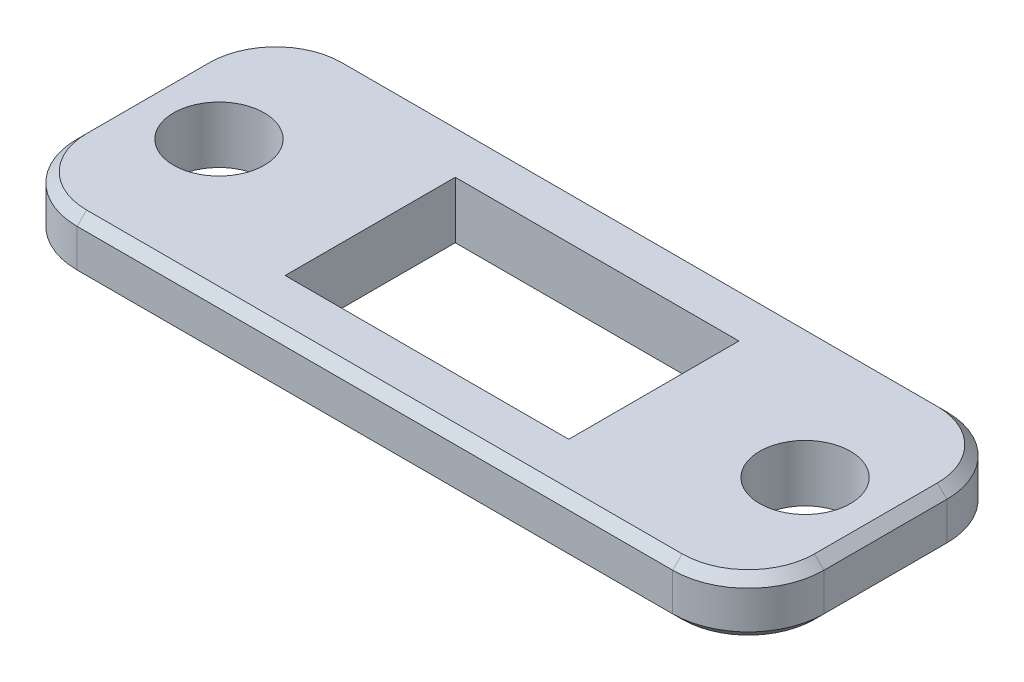
ISO-10303-21;
HEADER;
FILE_DESCRIPTION(('STEP AP214'),'2;1');
FILE_NAME('part.step','',(''),(''),'','','');
FILE_SCHEMA(('AUTOMOTIVE_DESIGN { 1 0 10303 214 1 1 1 1 }'));
ENDSEC;
DATA;
#1=APPLICATION_CONTEXT('core data for automotive mechanical design processes');
#2=APPLICATION_PROTOCOL_DEFINITION('international standard','automotive_design',2000,#1);
#3=PRODUCT_CONTEXT('',#1,'mechanical');
#4=PRODUCT('Part','Part','',(#3));
#5=PRODUCT_RELATED_PRODUCT_CATEGORY('part','',(#4));
#6=PRODUCT_DEFINITION_FORMATION('','',#4);
#7=PRODUCT_DEFINITION_CONTEXT('part definition',#1,'design');
#8=PRODUCT_DEFINITION('design','',#6,#7);
#9=PRODUCT_DEFINITION_SHAPE('','',#8);
#10=(LENGTH_UNIT() NAMED_UNIT(*) SI_UNIT(.MILLI.,.METRE.));
#11=(NAMED_UNIT(*) PLANE_ANGLE_UNIT() SI_UNIT($,.RADIAN.));
#12=(NAMED_UNIT(*) SI_UNIT($,.STERADIAN.) SOLID_ANGLE_UNIT());
#13=UNCERTAINTY_MEASURE_WITH_UNIT(LENGTH_MEASURE(1.E-05),#10,'distance_accuracy_value','');
#14=(GEOMETRIC_REPRESENTATION_CONTEXT(3) GLOBAL_UNCERTAINTY_ASSIGNED_CONTEXT((#13)) GLOBAL_UNIT_ASSIGNED_CONTEXT((#10,
#11,#12)) REPRESENTATION_CONTEXT('',''));
#15=CARTESIAN_POINT('',(0.,0.,0.));
#16=DIRECTION('',(0.,0.,1.));
#17=DIRECTION('',(1.,0.,0.));
#18=AXIS2_PLACEMENT_3D('',#15,#16,#17);
#19=CARTESIAN_POINT('',(0.,0.,0.));
#20=DIRECTION('',(0.,-1.,0.));
#21=DIRECTION('',(0.,0.,-1.));
#22=AXIS2_PLACEMENT_3D('',#19,#20,#21);
#23=PLANE('',#22);
#24=CARTESIAN_POINT('',(-15.75,0.,-3.25));
#25=DIRECTION('',(0.,-1.,0.));
#26=DIRECTION('',(0.,0.,-1.));
#27=AXIS2_PLACEMENT_3D('',#24,#25,#26);
#28=CIRCLE('',#27,3.5);
#29=CARTESIAN_POINT('',(-19.25,0.,-3.25));
#30=VERTEX_POINT('',#29);
#31=CARTESIAN_POINT('',(-15.75,0.,-6.74999999999999));
#32=VERTEX_POINT('',#31);
#33=EDGE_CURVE('E263',#30,#32,#28,.T.);
#34=ORIENTED_EDGE('',*,*,#33,.T.);
#35=DIRECTION('',(1.,0.,0.));
#36=VECTOR('',#35,1.);
#37=CARTESIAN_POINT('',(15.75,0.,-6.74999999999999));
#38=LINE('',#37,#36);
#39=CARTESIAN_POINT('',(15.75,0.,-6.74999999999999));
#40=VERTEX_POINT('',#39);
#41=EDGE_CURVE('E265',#32,#40,#38,.T.);
#42=ORIENTED_EDGE('',*,*,#41,.T.);
#43=CARTESIAN_POINT('',(15.75,0.,-3.25));
#44=DIRECTION('',(0.,-1.,0.));
#45=DIRECTION('',(0.,0.,-1.));
#46=AXIS2_PLACEMENT_3D('',#43,#44,#45);
#47=CIRCLE('',#46,3.5);
#48=CARTESIAN_POINT('',(19.25,0.,-3.25));
#49=VERTEX_POINT('',#48);
#50=EDGE_CURVE('E261',#40,#49,#47,.T.);
#51=ORIENTED_EDGE('',*,*,#50,.T.);
#52=DIRECTION('',(0.,0.,1.));
#53=VECTOR('',#52,1.);
#54=CARTESIAN_POINT('',(19.25,0.,3.25));
#55=LINE('',#54,#53);
#56=CARTESIAN_POINT('',(19.25,0.,3.25));
#57=VERTEX_POINT('',#56);
#58=EDGE_CURVE('E257',#49,#57,#55,.T.);
#59=ORIENTED_EDGE('',*,*,#58,.T.);
#60=CARTESIAN_POINT('',(15.75,0.,3.25));
#61=DIRECTION('',(0.,-1.,0.));
#62=DIRECTION('',(0.,0.,-1.));
#63=AXIS2_PLACEMENT_3D('',#60,#61,#62);
#64=CIRCLE('',#63,3.5);
#65=CARTESIAN_POINT('',(15.75,0.,6.75));
#66=VERTEX_POINT('',#65);
#67=EDGE_CURVE('E253',#57,#66,#64,.T.);
#68=ORIENTED_EDGE('',*,*,#67,.T.);
#69=DIRECTION('',(-1.,0.,0.));
#70=VECTOR('',#69,1.);
#71=CARTESIAN_POINT('',(-15.75,0.,6.75));
#72=LINE('',#71,#70);
#73=CARTESIAN_POINT('',(-15.75,0.,6.75));
#74=VERTEX_POINT('',#73);
#75=EDGE_CURVE('E251',#66,#74,#72,.T.);
#76=ORIENTED_EDGE('',*,*,#75,.T.);
#77=CARTESIAN_POINT('',(-15.75,0.,3.25));
#78=DIRECTION('',(0.,-1.,0.));
#79=DIRECTION('',(0.,0.,-1.));
#80=AXIS2_PLACEMENT_3D('',#77,#78,#79);
#81=CIRCLE('',#80,3.5);
#82=CARTESIAN_POINT('',(-19.25,0.,3.25));
#83=VERTEX_POINT('',#82);
#84=EDGE_CURVE('E255',#74,#83,#81,.T.);
#85=ORIENTED_EDGE('',*,*,#84,.T.);
#86=DIRECTION('',(0.,0.,-1.));
#87=VECTOR('',#86,1.);
#88=CARTESIAN_POINT('',(-19.25,0.,-3.24999999999999));
#89=LINE('',#88,#87);
#90=EDGE_CURVE('E259',#83,#30,#89,.T.);
#91=ORIENTED_EDGE('',*,*,#90,.T.);
#92=EDGE_LOOP('',(#34,#42,#51,#59,#68,#76,#85,#91));
#93=FACE_BOUND('',#92,.T.);
#94=CARTESIAN_POINT('',(-15.5,0.,0.));
#95=DIRECTION('',(0.,1.,0.));
#96=DIRECTION('',(0.,0.,1.));
#97=AXIS2_PLACEMENT_3D('',#94,#95,#96);
#98=CIRCLE('',#97,2.4);
#99=CARTESIAN_POINT('',(-15.5,0.,2.4));
#100=VERTEX_POINT('',#99);
#101=EDGE_CURVE('E434',#100,#100,#98,.T.);
#102=ORIENTED_EDGE('',*,*,#101,.T.);
#103=EDGE_LOOP('',(#102));
#104=FACE_BOUND('',#103,.T.);
#105=DIRECTION('',(1.,0.,0.));
#106=VECTOR('',#105,1.);
#107=CARTESIAN_POINT('',(-7.5,0.,4.5));
#108=LINE('',#107,#106);
#109=CARTESIAN_POINT('',(-7.5,0.,4.5));
#110=VERTEX_POINT('',#109);
#111=CARTESIAN_POINT('',(7.5,0.,4.5));
#112=VERTEX_POINT('',#111);
#113=EDGE_CURVE('E189',#110,#112,#108,.T.);
#114=ORIENTED_EDGE('',*,*,#113,.T.);
#115=DIRECTION('',(0.,0.,-1.));
#116=VECTOR('',#115,1.);
#117=CARTESIAN_POINT('',(7.5,0.,4.5));
#118=LINE('',#117,#116);
#119=CARTESIAN_POINT('',(7.5,0.,-4.5));
#120=VERTEX_POINT('',#119);
#121=EDGE_CURVE('E209',#112,#120,#118,.T.);
#122=ORIENTED_EDGE('',*,*,#121,.T.);
#123=DIRECTION('',(-1.,0.,0.));
#124=VECTOR('',#123,1.);
#125=CARTESIAN_POINT('',(-7.5,0.,-4.5));
#126=LINE('',#125,#124);
#127=CARTESIAN_POINT('',(-7.5,0.,-4.5));
#128=VERTEX_POINT('',#127);
#129=EDGE_CURVE('E195',#120,#128,#126,.T.);
#130=ORIENTED_EDGE('',*,*,#129,.T.);
#131=DIRECTION('',(0.,0.,1.));
#132=VECTOR('',#131,1.);
#133=CARTESIAN_POINT('',(-7.5,0.,4.5));
#134=LINE('',#133,#132);
#135=EDGE_CURVE('E213',#128,#110,#134,.T.);
#136=ORIENTED_EDGE('',*,*,#135,.T.);
#137=EDGE_LOOP('',(#114,#122,#130,#136));
#138=FACE_BOUND('',#137,.T.);
#139=CARTESIAN_POINT('',(15.5,0.,0.));
#140=DIRECTION('',(0.,1.,0.));
#141=DIRECTION('',(0.,0.,1.));
#142=AXIS2_PLACEMENT_3D('',#139,#140,#141);
#143=CIRCLE('',#142,2.4);
#144=CARTESIAN_POINT('',(15.5,0.,2.39999999999999));
#145=VERTEX_POINT('',#144);
#146=EDGE_CURVE('E211',#145,#145,#143,.T.);
#147=ORIENTED_EDGE('',*,*,#146,.T.);
#148=EDGE_LOOP('',(#147));
#149=FACE_BOUND('',#148,.T.);
#150=ADVANCED_FACE('F35',(#93,#104,#138,#149),#23,.T.);
#151=CARTESIAN_POINT('',(0.,3.,0.));
#152=DIRECTION('',(0.,-1.,0.));
#153=DIRECTION('',(0.,0.,-1.));
#154=AXIS2_PLACEMENT_3D('',#151,#152,#153);
#155=PLANE('',#154);
#156=CARTESIAN_POINT('',(15.75,3.,-3.25));
#157=DIRECTION('',(0.,-1.,0.));
#158=DIRECTION('',(0.,0.,-1.));
#159=AXIS2_PLACEMENT_3D('',#156,#157,#158);
#160=CIRCLE('',#159,3.5);
#161=CARTESIAN_POINT('',(19.25,3.,-3.25));
#162=VERTEX_POINT('',#161);
#163=CARTESIAN_POINT('',(15.75,3.,-6.74999999999999));
#164=VERTEX_POINT('',#163);
#165=EDGE_CURVE('E60',#162,#164,#160,.F.);
#166=ORIENTED_EDGE('',*,*,#165,.T.);
#167=DIRECTION('',(-1.,0.,0.));
#168=VECTOR('',#167,1.);
#169=CARTESIAN_POINT('',(0.,3.,-6.74999999999999));
#170=LINE('',#169,#168);
#171=CARTESIAN_POINT('',(-15.75,3.,-6.74999999999999));
#172=VERTEX_POINT('',#171);
#173=EDGE_CURVE('E11',#164,#172,#170,.T.);
#174=ORIENTED_EDGE('',*,*,#173,.T.);
#175=CARTESIAN_POINT('',(-15.75,3.,-3.25));
#176=DIRECTION('',(0.,-1.,0.));
#177=DIRECTION('',(0.,0.,-1.));
#178=AXIS2_PLACEMENT_3D('',#175,#176,#177);
#179=CIRCLE('',#178,3.5);
#180=CARTESIAN_POINT('',(-19.25,3.,-3.25));
#181=VERTEX_POINT('',#180);
#182=EDGE_CURVE('E45',#172,#181,#179,.F.);
#183=ORIENTED_EDGE('',*,*,#182,.T.);
#184=DIRECTION('',(0.,0.,1.));
#185=VECTOR('',#184,1.);
#186=CARTESIAN_POINT('',(-19.25,3.,0.));
#187=LINE('',#186,#185);
#188=CARTESIAN_POINT('',(-19.25,3.,3.25));
#189=VERTEX_POINT('',#188);
#190=EDGE_CURVE('E304',#181,#189,#187,.T.);
#191=ORIENTED_EDGE('',*,*,#190,.T.);
#192=CARTESIAN_POINT('',(-15.75,3.,3.25));
#193=DIRECTION('',(0.,-1.,0.));
#194=DIRECTION('',(0.,0.,-1.));
#195=AXIS2_PLACEMENT_3D('',#192,#193,#194);
#196=CIRCLE('',#195,3.5);
#197=CARTESIAN_POINT('',(-15.75,3.,6.75));
#198=VERTEX_POINT('',#197);
#199=EDGE_CURVE('E300',#189,#198,#196,.F.);
#200=ORIENTED_EDGE('',*,*,#199,.T.);
#201=DIRECTION('',(1.,0.,0.));
#202=VECTOR('',#201,1.);
#203=CARTESIAN_POINT('',(0.,3.,6.75));
#204=LINE('',#203,#202);
#205=CARTESIAN_POINT('',(15.75,3.,6.75));
#206=VERTEX_POINT('',#205);
#207=EDGE_CURVE('E296',#198,#206,#204,.T.);
#208=ORIENTED_EDGE('',*,*,#207,.T.);
#209=CARTESIAN_POINT('',(15.75,3.,3.25));
#210=DIRECTION('',(0.,-1.,0.));
#211=DIRECTION('',(0.,0.,-1.));
#212=AXIS2_PLACEMENT_3D('',#209,#210,#211);
#213=CIRCLE('',#212,3.5);
#214=CARTESIAN_POINT('',(19.25,3.,3.25));
#215=VERTEX_POINT('',#214);
#216=EDGE_CURVE('E298',#206,#215,#213,.F.);
#217=ORIENTED_EDGE('',*,*,#216,.T.);
#218=DIRECTION('',(0.,0.,-1.));
#219=VECTOR('',#218,1.);
#220=CARTESIAN_POINT('',(19.25,3.,0.));
#221=LINE('',#220,#219);
#222=EDGE_CURVE('E302',#215,#162,#221,.T.);
#223=ORIENTED_EDGE('',*,*,#222,.T.);
#224=EDGE_LOOP('',(#166,#174,#183,#191,#200,#208,#217,#223));
#225=FACE_BOUND('',#224,.T.);
#226=CARTESIAN_POINT('',(-15.5,3.,0.));
#227=DIRECTION('',(0.,1.,0.));
#228=DIRECTION('',(0.,0.,1.));
#229=AXIS2_PLACEMENT_3D('',#226,#227,#228);
#230=CIRCLE('',#229,2.4);
#231=CARTESIAN_POINT('',(-15.5,3.,2.4));
#232=VERTEX_POINT('',#231);
#233=EDGE_CURVE('E330',#232,#232,#230,.T.);
#234=ORIENTED_EDGE('',*,*,#233,.F.);
#235=EDGE_LOOP('',(#234));
#236=FACE_BOUND('',#235,.T.);
#237=CARTESIAN_POINT('',(15.5,3.,0.));
#238=DIRECTION('',(0.,1.,0.));
#239=DIRECTION('',(0.,0.,1.));
#240=AXIS2_PLACEMENT_3D('',#237,#238,#239);
#241=CIRCLE('',#240,2.4);
#242=CARTESIAN_POINT('',(15.5,3.,2.39999999999999));
#243=VERTEX_POINT('',#242);
#244=EDGE_CURVE('E432',#243,#243,#241,.T.);
#245=ORIENTED_EDGE('',*,*,#244,.F.);
#246=EDGE_LOOP('',(#245));
#247=FACE_BOUND('',#246,.T.);
#248=DIRECTION('',(0.,0.,-1.));
#249=VECTOR('',#248,1.);
#250=CARTESIAN_POINT('',(7.5,3.,4.5));
#251=LINE('',#250,#249);
#252=CARTESIAN_POINT('',(7.5,3.,4.5));
#253=VERTEX_POINT('',#252);
#254=CARTESIAN_POINT('',(7.5,3.,-4.5));
#255=VERTEX_POINT('',#254);
#256=EDGE_CURVE('E178',#253,#255,#251,.T.);
#257=ORIENTED_EDGE('',*,*,#256,.F.);
#258=DIRECTION('',(1.,0.,0.));
#259=VECTOR('',#258,1.);
#260=CARTESIAN_POINT('',(-7.5,3.,4.5));
#261=LINE('',#260,#259);
#262=CARTESIAN_POINT('',(-7.5,3.,4.5));
#263=VERTEX_POINT('',#262);
#264=EDGE_CURVE('E204',#263,#253,#261,.T.);
#265=ORIENTED_EDGE('',*,*,#264,.F.);
#266=DIRECTION('',(0.,0.,1.));
#267=VECTOR('',#266,1.);
#268=CARTESIAN_POINT('',(-7.5,3.,4.5));
#269=LINE('',#268,#267);
#270=CARTESIAN_POINT('',(-7.5,3.,-4.5));
#271=VERTEX_POINT('',#270);
#272=EDGE_CURVE('E202',#271,#263,#269,.T.);
#273=ORIENTED_EDGE('',*,*,#272,.F.);
#274=DIRECTION('',(-1.,0.,0.));
#275=VECTOR('',#274,1.);
#276=CARTESIAN_POINT('',(-7.5,3.,-4.5));
#277=LINE('',#276,#275);
#278=EDGE_CURVE('E188',#255,#271,#277,.T.);
#279=ORIENTED_EDGE('',*,*,#278,.F.);
#280=EDGE_LOOP('',(#257,#265,#273,#279));
#281=FACE_BOUND('',#280,.T.);
#282=ADVANCED_FACE('F200',(#225,#236,#247,#281),#155,.F.);
#283=CARTESIAN_POINT('',(19.75,3.,7.25));
#284=DIRECTION('',(-1.,0.,0.));
#285=DIRECTION('',(0.,0.,1.));
#286=AXIS2_PLACEMENT_3D('',#283,#284,#285);
#287=PLANE('',#286);
#288=DIRECTION('',(0.,-1.,0.));
#289=VECTOR('',#288,1.);
#290=CARTESIAN_POINT('',(19.75,3.,3.25));
#291=LINE('',#290,#289);
#292=CARTESIAN_POINT('',(19.75,2.5,3.25));
#293=VERTEX_POINT('',#292);
#294=CARTESIAN_POINT('',(19.75,0.500000000000004,3.25));
#295=VERTEX_POINT('',#294);
#296=EDGE_CURVE('E224',#293,#295,#291,.T.);
#297=ORIENTED_EDGE('',*,*,#296,.T.);
#298=DIRECTION('',(0.,0.,-1.));
#299=VECTOR('',#298,1.);
#300=CARTESIAN_POINT('',(19.75,0.500000000000004,-3.24999999999999));
#301=LINE('',#300,#299);
#302=CARTESIAN_POINT('',(19.75,0.500000000000004,-3.25));
#303=VERTEX_POINT('',#302);
#304=EDGE_CURVE('E282',#295,#303,#301,.T.);
#305=ORIENTED_EDGE('',*,*,#304,.T.);
#306=DIRECTION('',(0.,-1.,0.));
#307=VECTOR('',#306,1.);
#308=CARTESIAN_POINT('',(19.75,3.,-3.25));
#309=LINE('',#308,#307);
#310=CARTESIAN_POINT('',(19.75,2.5,-3.25));
#311=VERTEX_POINT('',#310);
#312=EDGE_CURVE('E196',#303,#311,#309,.F.);
#313=ORIENTED_EDGE('',*,*,#312,.T.);
#314=DIRECTION('',(0.,0.,1.));
#315=VECTOR('',#314,1.);
#316=CARTESIAN_POINT('',(19.75,2.5,7.25));
#317=LINE('',#316,#315);
#318=EDGE_CURVE('E280',#311,#293,#317,.T.);
#319=ORIENTED_EDGE('',*,*,#318,.T.);
#320=EDGE_LOOP('',(#297,#305,#313,#319));
#321=FACE_BOUND('',#320,.T.);
#322=ADVANCED_FACE('F395',(#321),#287,.F.);
#323=CARTESIAN_POINT('',(-19.75,3.,-7.25));
#324=DIRECTION('',(0.,0.,1.));
#325=DIRECTION('',(1.,0.,0.));
#326=AXIS2_PLACEMENT_3D('',#323,#324,#325);
#327=PLANE('',#326);
#328=DIRECTION('',(0.,-1.,0.));
#329=VECTOR('',#328,1.);
#330=CARTESIAN_POINT('',(15.75,3.,-7.25));
#331=LINE('',#330,#329);
#332=CARTESIAN_POINT('',(15.75,2.5,-7.25));
#333=VERTEX_POINT('',#332);
#334=CARTESIAN_POINT('',(15.75,0.500000000000004,-7.25));
#335=VERTEX_POINT('',#334);
#336=EDGE_CURVE('E236',#333,#335,#331,.T.);
#337=ORIENTED_EDGE('',*,*,#336,.T.);
#338=DIRECTION('',(-1.,0.,0.));
#339=VECTOR('',#338,1.);
#340=CARTESIAN_POINT('',(-15.75,0.500000000000004,-7.25));
#341=LINE('',#340,#339);
#342=CARTESIAN_POINT('',(-15.75,0.500000000000004,-7.25));
#343=VERTEX_POINT('',#342);
#344=EDGE_CURVE('E248',#335,#343,#341,.T.);
#345=ORIENTED_EDGE('',*,*,#344,.T.);
#346=DIRECTION('',(0.,-1.,0.));
#347=VECTOR('',#346,1.);
#348=CARTESIAN_POINT('',(-15.75,3.,-7.25));
#349=LINE('',#348,#347);
#350=CARTESIAN_POINT('',(-15.75,2.5,-7.25));
#351=VERTEX_POINT('',#350);
#352=EDGE_CURVE('E233',#343,#351,#349,.F.);
#353=ORIENTED_EDGE('',*,*,#352,.T.);
#354=DIRECTION('',(1.,0.,0.));
#355=VECTOR('',#354,1.);
#356=CARTESIAN_POINT('',(-19.75,2.5,-7.25));
#357=LINE('',#356,#355);
#358=EDGE_CURVE('E245',#351,#333,#357,.T.);
#359=ORIENTED_EDGE('',*,*,#358,.T.);
#360=EDGE_LOOP('',(#337,#345,#353,#359));
#361=FACE_BOUND('',#360,.T.);
#362=ADVANCED_FACE('F415',(#361),#327,.F.);
#363=CARTESIAN_POINT('',(-19.75,3.,7.25));
#364=DIRECTION('',(1.,0.,0.));
#365=DIRECTION('',(0.,0.,-1.));
#366=AXIS2_PLACEMENT_3D('',#363,#364,#365);
#367=PLANE('',#366);
#368=DIRECTION('',(0.,-1.,0.));
#369=VECTOR('',#368,1.);
#370=CARTESIAN_POINT('',(-19.75,3.,-3.25));
#371=LINE('',#370,#369);
#372=CARTESIAN_POINT('',(-19.75,2.5,-3.25));
#373=VERTEX_POINT('',#372);
#374=CARTESIAN_POINT('',(-19.75,0.500000000000004,-3.25));
#375=VERTEX_POINT('',#374);
#376=EDGE_CURVE('E239',#373,#375,#371,.T.);
#377=ORIENTED_EDGE('',*,*,#376,.T.);
#378=DIRECTION('',(0.,0.,1.));
#379=VECTOR('',#378,1.);
#380=CARTESIAN_POINT('',(-19.75,0.500000000000004,3.25));
#381=LINE('',#380,#379);
#382=CARTESIAN_POINT('',(-19.75,0.500000000000004,3.25));
#383=VERTEX_POINT('',#382);
#384=EDGE_CURVE('E278',#375,#383,#381,.T.);
#385=ORIENTED_EDGE('',*,*,#384,.T.);
#386=DIRECTION('',(0.,-1.,0.));
#387=VECTOR('',#386,1.);
#388=CARTESIAN_POINT('',(-19.75,3.,3.25));
#389=LINE('',#388,#387);
#390=CARTESIAN_POINT('',(-19.75,2.5,3.25));
#391=VERTEX_POINT('',#390);
#392=EDGE_CURVE('E242',#383,#391,#389,.F.);
#393=ORIENTED_EDGE('',*,*,#392,.T.);
#394=DIRECTION('',(0.,0.,-1.));
#395=VECTOR('',#394,1.);
#396=CARTESIAN_POINT('',(-19.75,2.5,7.25));
#397=LINE('',#396,#395);
#398=EDGE_CURVE('E276',#391,#373,#397,.T.);
#399=ORIENTED_EDGE('',*,*,#398,.T.);
#400=EDGE_LOOP('',(#377,#385,#393,#399));
#401=FACE_BOUND('',#400,.T.);
#402=ADVANCED_FACE('F463',(#401),#367,.F.);
#403=CARTESIAN_POINT('',(-19.75,3.,7.25));
#404=DIRECTION('',(0.,0.,-1.));
#405=DIRECTION('',(-1.,0.,0.));
#406=AXIS2_PLACEMENT_3D('',#403,#404,#405);
#407=PLANE('',#406);
#408=DIRECTION('',(0.,-1.,0.));
#409=VECTOR('',#408,1.);
#410=CARTESIAN_POINT('',(-15.75,3.,7.25));
#411=LINE('',#410,#409);
#412=CARTESIAN_POINT('',(-15.75,2.5,7.25));
#413=VERTEX_POINT('',#412);
#414=CARTESIAN_POINT('',(-15.75,0.500000000000004,7.25));
#415=VERTEX_POINT('',#414);
#416=EDGE_CURVE('E227',#413,#415,#411,.T.);
#417=ORIENTED_EDGE('',*,*,#416,.T.);
#418=DIRECTION('',(1.,0.,0.));
#419=VECTOR('',#418,1.);
#420=CARTESIAN_POINT('',(15.75,0.500000000000004,7.25));
#421=LINE('',#420,#419);
#422=CARTESIAN_POINT('',(15.75,0.500000000000004,7.25));
#423=VERTEX_POINT('',#422);
#424=EDGE_CURVE('E294',#415,#423,#421,.T.);
#425=ORIENTED_EDGE('',*,*,#424,.T.);
#426=DIRECTION('',(0.,-1.,0.));
#427=VECTOR('',#426,1.);
#428=CARTESIAN_POINT('',(15.75,3.,7.25));
#429=LINE('',#428,#427);
#430=CARTESIAN_POINT('',(15.75,2.5,7.25));
#431=VERTEX_POINT('',#430);
#432=EDGE_CURVE('E230',#423,#431,#429,.F.);
#433=ORIENTED_EDGE('',*,*,#432,.T.);
#434=DIRECTION('',(-1.,0.,0.));
#435=VECTOR('',#434,1.);
#436=CARTESIAN_POINT('',(-19.75,2.5,7.25));
#437=LINE('',#436,#435);
#438=EDGE_CURVE('E292',#431,#413,#437,.T.);
#439=ORIENTED_EDGE('',*,*,#438,.T.);
#440=EDGE_LOOP('',(#417,#425,#433,#439));
#441=FACE_BOUND('',#440,.T.);
#442=ADVANCED_FACE('F363',(#441),#407,.F.);
#443=CARTESIAN_POINT('',(7.5,3.,4.5));
#444=DIRECTION('',(-1.,0.,0.));
#445=DIRECTION('',(0.,0.,1.));
#446=AXIS2_PLACEMENT_3D('',#443,#444,#445);
#447=PLANE('',#446);
#448=ORIENTED_EDGE('',*,*,#121,.F.);
#449=DIRECTION('',(0.,-1.,0.));
#450=VECTOR('',#449,1.);
#451=CARTESIAN_POINT('',(7.5,3.,4.5));
#452=LINE('',#451,#450);
#453=EDGE_CURVE('E184',#253,#112,#452,.T.);
#454=ORIENTED_EDGE('',*,*,#453,.F.);
#455=ORIENTED_EDGE('',*,*,#256,.T.);
#456=DIRECTION('',(0.,-1.,0.));
#457=VECTOR('',#456,1.);
#458=CARTESIAN_POINT('',(7.5,3.,-4.5));
#459=LINE('',#458,#457);
#460=EDGE_CURVE('E181',#255,#120,#459,.T.);
#461=ORIENTED_EDGE('',*,*,#460,.T.);
#462=EDGE_LOOP('',(#448,#454,#455,#461));
#463=FACE_BOUND('',#462,.T.);
#464=ADVANCED_FACE('F180',(#463),#447,.T.);
#465=CARTESIAN_POINT('',(-7.5,3.,-4.5));
#466=DIRECTION('',(0.,0.,1.));
#467=DIRECTION('',(1.,0.,0.));
#468=AXIS2_PLACEMENT_3D('',#465,#466,#467);
#469=PLANE('',#468);
#470=ORIENTED_EDGE('',*,*,#129,.F.);
#471=ORIENTED_EDGE('',*,*,#460,.F.);
#472=ORIENTED_EDGE('',*,*,#278,.T.);
#473=DIRECTION('',(0.,-1.,0.));
#474=VECTOR('',#473,1.);
#475=CARTESIAN_POINT('',(-7.5,3.,-4.5));
#476=LINE('',#475,#474);
#477=EDGE_CURVE('E197',#271,#128,#476,.T.);
#478=ORIENTED_EDGE('',*,*,#477,.T.);
#479=EDGE_LOOP('',(#470,#471,#472,#478));
#480=FACE_BOUND('',#479,.T.);
#481=ADVANCED_FACE('F192',(#480),#469,.T.);
#482=CARTESIAN_POINT('',(-7.5,3.,4.5));
#483=DIRECTION('',(1.,0.,0.));
#484=DIRECTION('',(0.,0.,-1.));
#485=AXIS2_PLACEMENT_3D('',#482,#483,#484);
#486=PLANE('',#485);
#487=ORIENTED_EDGE('',*,*,#135,.F.);
#488=ORIENTED_EDGE('',*,*,#477,.F.);
#489=ORIENTED_EDGE('',*,*,#272,.T.);
#490=DIRECTION('',(0.,-1.,0.));
#491=VECTOR('',#490,1.);
#492=CARTESIAN_POINT('',(-7.5,3.,4.5));
#493=LINE('',#492,#491);
#494=EDGE_CURVE('E219',#263,#110,#493,.T.);
#495=ORIENTED_EDGE('',*,*,#494,.T.);
#496=EDGE_LOOP('',(#487,#488,#489,#495));
#497=FACE_BOUND('',#496,.T.);
#498=ADVANCED_FACE('F679',(#497),#486,.T.);
#499=CARTESIAN_POINT('',(-7.5,3.,4.5));
#500=DIRECTION('',(0.,0.,-1.));
#501=DIRECTION('',(-1.,0.,0.));
#502=AXIS2_PLACEMENT_3D('',#499,#500,#501);
#503=PLANE('',#502);
#504=ORIENTED_EDGE('',*,*,#113,.F.);
#505=ORIENTED_EDGE('',*,*,#494,.F.);
#506=ORIENTED_EDGE('',*,*,#264,.T.);
#507=ORIENTED_EDGE('',*,*,#453,.T.);
#508=EDGE_LOOP('',(#504,#505,#506,#507));
#509=FACE_BOUND('',#508,.T.);
#510=ADVANCED_FACE('F473',(#509),#503,.T.);
#511=CARTESIAN_POINT('',(15.75,3.,3.25));
#512=DIRECTION('',(0.,-1.,0.));
#513=DIRECTION('',(0.,0.,-1.));
#514=AXIS2_PLACEMENT_3D('',#511,#512,#513);
#515=CYLINDRICAL_SURFACE('',#514,4.);
#516=ORIENTED_EDGE('',*,*,#432,.F.);
#517=CARTESIAN_POINT('',(15.75,0.500000000000004,3.25));
#518=DIRECTION('',(0.,-1.,0.));
#519=DIRECTION('',(0.,0.,-1.));
#520=AXIS2_PLACEMENT_3D('',#517,#518,#519);
#521=CIRCLE('',#520,4.);
#522=EDGE_CURVE('E290',#423,#295,#521,.F.);
#523=ORIENTED_EDGE('',*,*,#522,.T.);
#524=ORIENTED_EDGE('',*,*,#296,.F.);
#525=CARTESIAN_POINT('',(15.75,2.5,3.25));
#526=DIRECTION('',(0.,-1.,0.));
#527=DIRECTION('',(0.,0.,-1.));
#528=AXIS2_PLACEMENT_3D('',#525,#526,#527);
#529=CIRCLE('',#528,4.);
#530=EDGE_CURVE('E288',#293,#431,#529,.T.);
#531=ORIENTED_EDGE('',*,*,#530,.T.);
#532=EDGE_LOOP('',(#516,#523,#524,#531));
#533=FACE_BOUND('',#532,.T.);
#534=ADVANCED_FACE('F391',(#533),#515,.T.);
#535=CARTESIAN_POINT('',(15.75,3.,-3.25));
#536=DIRECTION('',(0.,-1.,0.));
#537=DIRECTION('',(0.,0.,-1.));
#538=AXIS2_PLACEMENT_3D('',#535,#536,#537);
#539=CYLINDRICAL_SURFACE('',#538,4.);
#540=ORIENTED_EDGE('',*,*,#312,.F.);
#541=CARTESIAN_POINT('',(15.75,0.500000000000004,-3.25));
#542=DIRECTION('',(0.,-1.,0.));
#543=DIRECTION('',(0.,0.,-1.));
#544=AXIS2_PLACEMENT_3D('',#541,#542,#543);
#545=CIRCLE('',#544,4.);
#546=EDGE_CURVE('E274',#303,#335,#545,.F.);
#547=ORIENTED_EDGE('',*,*,#546,.T.);
#548=ORIENTED_EDGE('',*,*,#336,.F.);
#549=CARTESIAN_POINT('',(15.75,2.5,-3.25));
#550=DIRECTION('',(0.,-1.,0.));
#551=DIRECTION('',(0.,0.,-1.));
#552=AXIS2_PLACEMENT_3D('',#549,#550,#551);
#553=CIRCLE('',#552,4.);
#554=EDGE_CURVE('E272',#333,#311,#553,.T.);
#555=ORIENTED_EDGE('',*,*,#554,.T.);
#556=EDGE_LOOP('',(#540,#547,#548,#555));
#557=FACE_BOUND('',#556,.T.);
#558=ADVANCED_FACE('F413',(#557),#539,.T.);
#559=CARTESIAN_POINT('',(-15.75,3.,3.25));
#560=DIRECTION('',(0.,-1.,0.));
#561=DIRECTION('',(0.,0.,-1.));
#562=AXIS2_PLACEMENT_3D('',#559,#560,#561);
#563=CYLINDRICAL_SURFACE('',#562,4.);
#564=ORIENTED_EDGE('',*,*,#392,.F.);
#565=CARTESIAN_POINT('',(-15.75,0.500000000000004,3.25));
#566=DIRECTION('',(0.,-1.,0.));
#567=DIRECTION('',(0.,0.,-1.));
#568=AXIS2_PLACEMENT_3D('',#565,#566,#567);
#569=CIRCLE('',#568,4.);
#570=EDGE_CURVE('E286',#383,#415,#569,.F.);
#571=ORIENTED_EDGE('',*,*,#570,.T.);
#572=ORIENTED_EDGE('',*,*,#416,.F.);
#573=CARTESIAN_POINT('',(-15.75,2.5,3.25));
#574=DIRECTION('',(0.,-1.,0.));
#575=DIRECTION('',(0.,0.,-1.));
#576=AXIS2_PLACEMENT_3D('',#573,#574,#575);
#577=CIRCLE('',#576,4.);
#578=EDGE_CURVE('E284',#413,#391,#577,.T.);
#579=ORIENTED_EDGE('',*,*,#578,.T.);
#580=EDGE_LOOP('',(#564,#571,#572,#579));
#581=FACE_BOUND('',#580,.T.);
#582=ADVANCED_FACE('F368',(#581),#563,.T.);
#583=CARTESIAN_POINT('',(-15.75,3.,-3.25));
#584=DIRECTION('',(0.,-1.,0.));
#585=DIRECTION('',(0.,0.,-1.));
#586=AXIS2_PLACEMENT_3D('',#583,#584,#585);
#587=CYLINDRICAL_SURFACE('',#586,4.);
#588=ORIENTED_EDGE('',*,*,#352,.F.);
#589=CARTESIAN_POINT('',(-15.75,0.500000000000004,-3.25));
#590=DIRECTION('',(0.,-1.,0.));
#591=DIRECTION('',(0.,0.,-1.));
#592=AXIS2_PLACEMENT_3D('',#589,#590,#591);
#593=CIRCLE('',#592,4.);
#594=EDGE_CURVE('E270',#343,#375,#593,.F.);
#595=ORIENTED_EDGE('',*,*,#594,.T.);
#596=ORIENTED_EDGE('',*,*,#376,.F.);
#597=CARTESIAN_POINT('',(-15.75,2.5,-3.25));
#598=DIRECTION('',(0.,-1.,0.));
#599=DIRECTION('',(0.,0.,-1.));
#600=AXIS2_PLACEMENT_3D('',#597,#598,#599);
#601=CIRCLE('',#600,4.);
#602=EDGE_CURVE('E268',#373,#351,#601,.T.);
#603=ORIENTED_EDGE('',*,*,#602,.T.);
#604=EDGE_LOOP('',(#588,#595,#596,#603));
#605=FACE_BOUND('',#604,.T.);
#606=ADVANCED_FACE('F451',(#605),#587,.T.);
#607=CARTESIAN_POINT('',(15.5,3.,0.));
#608=DIRECTION('',(0.,1.,0.));
#609=DIRECTION('',(0.,0.,1.));
#610=AXIS2_PLACEMENT_3D('',#607,#608,#609);
#611=CYLINDRICAL_SURFACE('',#610,2.4);
#612=ORIENTED_EDGE('',*,*,#146,.F.);
#613=EDGE_LOOP('',(#612));
#614=FACE_BOUND('',#613,.T.);
#615=ORIENTED_EDGE('',*,*,#244,.T.);
#616=EDGE_LOOP('',(#615));
#617=FACE_BOUND('',#616,.T.);
#618=ADVANCED_FACE('F443',(#614,#617),#611,.F.);
#619=CARTESIAN_POINT('',(-15.5,3.,0.));
#620=DIRECTION('',(0.,1.,0.));
#621=DIRECTION('',(0.,0.,1.));
#622=AXIS2_PLACEMENT_3D('',#619,#620,#621);
#623=CYLINDRICAL_SURFACE('',#622,2.4);
#624=ORIENTED_EDGE('',*,*,#101,.F.);
#625=EDGE_LOOP('',(#624));
#626=FACE_BOUND('',#625,.T.);
#627=ORIENTED_EDGE('',*,*,#233,.T.);
#628=EDGE_LOOP('',(#627));
#629=FACE_BOUND('',#628,.T.);
#630=ADVANCED_FACE('F441',(#626,#629),#623,.F.);
#631=CARTESIAN_POINT('',(-19.75,0.500000000000004,7.25));
#632=DIRECTION('',(0.,-0.707106781186547,0.707106781186547));
#633=DIRECTION('',(-1.,0.,0.));
#634=AXIS2_PLACEMENT_3D('',#631,#632,#633);
#635=PLANE('',#634);
#636=DIRECTION('',(0.,0.707106781186547,0.707106781186547));
#637=VECTOR('',#636,1.);
#638=CARTESIAN_POINT('',(-15.75,0.,6.75));
#639=LINE('',#638,#637);
#640=EDGE_CURVE('E324',#74,#415,#639,.T.);
#641=ORIENTED_EDGE('',*,*,#640,.F.);
#642=ORIENTED_EDGE('',*,*,#75,.F.);
#643=DIRECTION('',(0.,-0.707106781186547,-0.707106781186547));
#644=VECTOR('',#643,1.);
#645=CARTESIAN_POINT('',(15.75,0.500000000000004,7.25));
#646=LINE('',#645,#644);
#647=EDGE_CURVE('E327',#423,#66,#646,.T.);
#648=ORIENTED_EDGE('',*,*,#647,.F.);
#649=ORIENTED_EDGE('',*,*,#424,.F.);
#650=EDGE_LOOP('',(#641,#642,#648,#649));
#651=FACE_BOUND('',#650,.T.);
#652=ADVANCED_FACE('F388',(#651),#635,.T.);
#653=CARTESIAN_POINT('',(15.75,0.,3.25));
#654=DIRECTION('',(0.,1.,0.));
#655=DIRECTION('',(0.,0.,1.));
#656=AXIS2_PLACEMENT_3D('',#653,#654,#655);
#657=CONICAL_SURFACE('',#656,3.5,0.785398163397448);
#658=ORIENTED_EDGE('',*,*,#647,.T.);
#659=ORIENTED_EDGE('',*,*,#67,.F.);
#660=DIRECTION('',(-0.707106781186547,-0.707106781186547,0.));
#661=VECTOR('',#660,1.);
#662=CARTESIAN_POINT('',(19.75,0.500000000000004,3.25));
#663=LINE('',#662,#661);
#664=EDGE_CURVE('E321',#295,#57,#663,.T.);
#665=ORIENTED_EDGE('',*,*,#664,.F.);
#666=ORIENTED_EDGE('',*,*,#522,.F.);
#667=EDGE_LOOP('',(#658,#659,#665,#666));
#668=FACE_BOUND('',#667,.T.);
#669=ADVANCED_FACE('F400',(#668),#657,.T.);
#670=CARTESIAN_POINT('',(-15.75,0.,3.25));
#671=DIRECTION('',(0.,1.,0.));
#672=DIRECTION('',(0.,0.,1.));
#673=AXIS2_PLACEMENT_3D('',#670,#671,#672);
#674=CONICAL_SURFACE('',#673,3.5,0.785398163397448);
#675=ORIENTED_EDGE('',*,*,#640,.T.);
#676=ORIENTED_EDGE('',*,*,#570,.F.);
#677=DIRECTION('',(-0.707106781186547,0.707106781186547,0.));
#678=VECTOR('',#677,1.);
#679=CARTESIAN_POINT('',(-19.25,0.,3.25));
#680=LINE('',#679,#678);
#681=EDGE_CURVE('E318',#83,#383,#680,.T.);
#682=ORIENTED_EDGE('',*,*,#681,.F.);
#683=ORIENTED_EDGE('',*,*,#84,.F.);
#684=EDGE_LOOP('',(#675,#676,#682,#683));
#685=FACE_BOUND('',#684,.T.);
#686=ADVANCED_FACE('F372',(#685),#674,.T.);
#687=CARTESIAN_POINT('',(19.75,0.500000000000004,7.25));
#688=DIRECTION('',(0.707106781186547,-0.707106781186547,0.));
#689=DIRECTION('',(0.,0.,1.));
#690=AXIS2_PLACEMENT_3D('',#687,#688,#689);
#691=PLANE('',#690);
#692=ORIENTED_EDGE('',*,*,#664,.T.);
#693=ORIENTED_EDGE('',*,*,#58,.F.);
#694=DIRECTION('',(-0.707106781186547,-0.707106781186547,0.));
#695=VECTOR('',#694,1.);
#696=CARTESIAN_POINT('',(19.75,0.500000000000004,-3.25));
#697=LINE('',#696,#695);
#698=EDGE_CURVE('E315',#303,#49,#697,.T.);
#699=ORIENTED_EDGE('',*,*,#698,.F.);
#700=ORIENTED_EDGE('',*,*,#304,.F.);
#701=EDGE_LOOP('',(#692,#693,#699,#700));
#702=FACE_BOUND('',#701,.T.);
#703=ADVANCED_FACE('F404',(#702),#691,.T.);
#704=CARTESIAN_POINT('',(-19.75,0.500000000000004,7.25));
#705=DIRECTION('',(-0.707106781186547,-0.707106781186547,0.));
#706=DIRECTION('',(0.,0.,-1.));
#707=AXIS2_PLACEMENT_3D('',#704,#705,#706);
#708=PLANE('',#707);
#709=ORIENTED_EDGE('',*,*,#681,.T.);
#710=ORIENTED_EDGE('',*,*,#384,.F.);
#711=DIRECTION('',(-0.707106781186547,0.707106781186547,0.));
#712=VECTOR('',#711,1.);
#713=CARTESIAN_POINT('',(-19.25,0.,-3.25));
#714=LINE('',#713,#712);
#715=EDGE_CURVE('E312',#30,#375,#714,.T.);
#716=ORIENTED_EDGE('',*,*,#715,.F.);
#717=ORIENTED_EDGE('',*,*,#90,.F.);
#718=EDGE_LOOP('',(#709,#710,#716,#717));
#719=FACE_BOUND('',#718,.T.);
#720=ADVANCED_FACE('F378',(#719),#708,.T.);
#721=CARTESIAN_POINT('',(15.75,0.,-3.25));
#722=DIRECTION('',(0.,1.,0.));
#723=DIRECTION('',(0.,0.,1.));
#724=AXIS2_PLACEMENT_3D('',#721,#722,#723);
#725=CONICAL_SURFACE('',#724,3.5,0.785398163397448);
#726=ORIENTED_EDGE('',*,*,#698,.T.);
#727=ORIENTED_EDGE('',*,*,#50,.F.);
#728=DIRECTION('',(0.,-0.707106781186547,0.707106781186547));
#729=VECTOR('',#728,1.);
#730=CARTESIAN_POINT('',(15.75,0.500000000000004,-7.25));
#731=LINE('',#730,#729);
#732=EDGE_CURVE('E310',#335,#40,#731,.T.);
#733=ORIENTED_EDGE('',*,*,#732,.F.);
#734=ORIENTED_EDGE('',*,*,#546,.F.);
#735=EDGE_LOOP('',(#726,#727,#733,#734));
#736=FACE_BOUND('',#735,.T.);
#737=ADVANCED_FACE('F409',(#736),#725,.T.);
#738=CARTESIAN_POINT('',(-15.75,0.,-3.25));
#739=DIRECTION('',(0.,1.,0.));
#740=DIRECTION('',(0.,0.,1.));
#741=AXIS2_PLACEMENT_3D('',#738,#739,#740);
#742=CONICAL_SURFACE('',#741,3.5,0.785398163397448);
#743=ORIENTED_EDGE('',*,*,#715,.T.);
#744=ORIENTED_EDGE('',*,*,#594,.F.);
#745=DIRECTION('',(0.,0.707106781186547,-0.707106781186547));
#746=VECTOR('',#745,1.);
#747=CARTESIAN_POINT('',(-15.75,0.,-6.74999999999999));
#748=LINE('',#747,#746);
#749=EDGE_CURVE('E308',#32,#343,#748,.T.);
#750=ORIENTED_EDGE('',*,*,#749,.F.);
#751=ORIENTED_EDGE('',*,*,#33,.F.);
#752=EDGE_LOOP('',(#743,#744,#750,#751));
#753=FACE_BOUND('',#752,.T.);
#754=ADVANCED_FACE('F488',(#753),#742,.T.);
#755=CARTESIAN_POINT('',(-19.75,0.500000000000004,-7.25));
#756=DIRECTION('',(0.,-0.707106781186547,-0.707106781186547));
#757=DIRECTION('',(1.,0.,0.));
#758=AXIS2_PLACEMENT_3D('',#755,#756,#757);
#759=PLANE('',#758);
#760=ORIENTED_EDGE('',*,*,#732,.T.);
#761=ORIENTED_EDGE('',*,*,#41,.F.);
#762=ORIENTED_EDGE('',*,*,#749,.T.);
#763=ORIENTED_EDGE('',*,*,#344,.F.);
#764=EDGE_LOOP('',(#760,#761,#762,#763));
#765=FACE_BOUND('',#764,.T.);
#766=ADVANCED_FACE('F482',(#765),#759,.T.);
#767=CARTESIAN_POINT('',(0.,3.,6.75));
#768=DIRECTION('',(0.,-0.707106781186547,-0.707106781186547));
#769=DIRECTION('',(1.,0.,0.));
#770=AXIS2_PLACEMENT_3D('',#767,#768,#769);
#771=PLANE('',#770);
#772=DIRECTION('',(0.,0.707106781186547,-0.707106781186547));
#773=VECTOR('',#772,1.);
#774=CARTESIAN_POINT('',(-15.75,2.5,7.25));
#775=LINE('',#774,#773);
#776=EDGE_CURVE('E345',#413,#198,#775,.T.);
#777=ORIENTED_EDGE('',*,*,#776,.F.);
#778=ORIENTED_EDGE('',*,*,#438,.F.);
#779=DIRECTION('',(0.,-0.707106781186547,0.707106781186547));
#780=VECTOR('',#779,1.);
#781=CARTESIAN_POINT('',(15.75,3.,6.75));
#782=LINE('',#781,#780);
#783=EDGE_CURVE('E40',#206,#431,#782,.T.);
#784=ORIENTED_EDGE('',*,*,#783,.F.);
#785=ORIENTED_EDGE('',*,*,#207,.F.);
#786=EDGE_LOOP('',(#777,#778,#784,#785));
#787=FACE_BOUND('',#786,.T.);
#788=ADVANCED_FACE('F38',(#787),#771,.F.);
#789=CARTESIAN_POINT('',(15.75,3.,3.25));
#790=DIRECTION('',(0.,-1.,0.));
#791=DIRECTION('',(0.,0.,-1.));
#792=AXIS2_PLACEMENT_3D('',#789,#790,#791);
#793=CONICAL_SURFACE('',#792,3.5,0.785398163397448);
#794=ORIENTED_EDGE('',*,*,#783,.T.);
#795=ORIENTED_EDGE('',*,*,#530,.F.);
#796=DIRECTION('',(0.707106781186547,-0.707106781186547,0.));
#797=VECTOR('',#796,1.);
#798=CARTESIAN_POINT('',(19.25,3.,3.25));
#799=LINE('',#798,#797);
#800=EDGE_CURVE('E343',#215,#293,#799,.T.);
#801=ORIENTED_EDGE('',*,*,#800,.F.);
#802=ORIENTED_EDGE('',*,*,#216,.F.);
#803=EDGE_LOOP('',(#794,#795,#801,#802));
#804=FACE_BOUND('',#803,.T.);
#805=ADVANCED_FACE('F356',(#804),#793,.T.);
#806=CARTESIAN_POINT('',(-15.75,3.,3.25));
#807=DIRECTION('',(0.,-1.,0.));
#808=DIRECTION('',(0.,0.,-1.));
#809=AXIS2_PLACEMENT_3D('',#806,#807,#808);
#810=CONICAL_SURFACE('',#809,3.5,0.785398163397448);
#811=ORIENTED_EDGE('',*,*,#776,.T.);
#812=ORIENTED_EDGE('',*,*,#199,.F.);
#813=DIRECTION('',(0.707106781186547,0.707106781186547,0.));
#814=VECTOR('',#813,1.);
#815=CARTESIAN_POINT('',(-19.75,2.5,3.25));
#816=LINE('',#815,#814);
#817=EDGE_CURVE('E340',#391,#189,#816,.T.);
#818=ORIENTED_EDGE('',*,*,#817,.F.);
#819=ORIENTED_EDGE('',*,*,#578,.F.);
#820=EDGE_LOOP('',(#811,#812,#818,#819));
#821=FACE_BOUND('',#820,.T.);
#822=ADVANCED_FACE('F554',(#821),#810,.T.);
#823=CARTESIAN_POINT('',(19.25,3.,0.));
#824=DIRECTION('',(-0.707106781186547,-0.707106781186547,0.));
#825=DIRECTION('',(0.,0.,-1.));
#826=AXIS2_PLACEMENT_3D('',#823,#824,#825);
#827=PLANE('',#826);
#828=ORIENTED_EDGE('',*,*,#800,.T.);
#829=ORIENTED_EDGE('',*,*,#318,.F.);
#830=DIRECTION('',(0.707106781186547,-0.707106781186547,0.));
#831=VECTOR('',#830,1.);
#832=CARTESIAN_POINT('',(19.25,3.,-3.25));
#833=LINE('',#832,#831);
#834=EDGE_CURVE('E337',#162,#311,#833,.T.);
#835=ORIENTED_EDGE('',*,*,#834,.F.);
#836=ORIENTED_EDGE('',*,*,#222,.F.);
#837=EDGE_LOOP('',(#828,#829,#835,#836));
#838=FACE_BOUND('',#837,.T.);
#839=ADVANCED_FACE('F547',(#838),#827,.F.);
#840=CARTESIAN_POINT('',(-19.25,3.,0.));
#841=DIRECTION('',(0.707106781186547,-0.707106781186547,0.));
#842=DIRECTION('',(0.,0.,1.));
#843=AXIS2_PLACEMENT_3D('',#840,#841,#842);
#844=PLANE('',#843);
#845=ORIENTED_EDGE('',*,*,#817,.T.);
#846=ORIENTED_EDGE('',*,*,#190,.F.);
#847=DIRECTION('',(0.707106781186547,0.707106781186547,0.));
#848=VECTOR('',#847,1.);
#849=CARTESIAN_POINT('',(-19.75,2.5,-3.25));
#850=LINE('',#849,#848);
#851=EDGE_CURVE('E334',#373,#181,#850,.T.);
#852=ORIENTED_EDGE('',*,*,#851,.F.);
#853=ORIENTED_EDGE('',*,*,#398,.F.);
#854=EDGE_LOOP('',(#845,#846,#852,#853));
#855=FACE_BOUND('',#854,.T.);
#856=ADVANCED_FACE('F540',(#855),#844,.F.);
#857=CARTESIAN_POINT('',(15.75,3.,-3.25));
#858=DIRECTION('',(0.,-1.,0.));
#859=DIRECTION('',(0.,0.,-1.));
#860=AXIS2_PLACEMENT_3D('',#857,#858,#859);
#861=CONICAL_SURFACE('',#860,3.5,0.785398163397448);
#862=ORIENTED_EDGE('',*,*,#834,.T.);
#863=ORIENTED_EDGE('',*,*,#554,.F.);
#864=DIRECTION('',(0.,-0.707106781186547,-0.707106781186547));
#865=VECTOR('',#864,1.);
#866=CARTESIAN_POINT('',(15.75,3.,-6.74999999999999));
#867=LINE('',#866,#865);
#868=EDGE_CURVE('E332',#164,#333,#867,.T.);
#869=ORIENTED_EDGE('',*,*,#868,.F.);
#870=ORIENTED_EDGE('',*,*,#165,.F.);
#871=EDGE_LOOP('',(#862,#863,#869,#870));
#872=FACE_BOUND('',#871,.T.);
#873=ADVANCED_FACE('F534',(#872),#861,.T.);
#874=CARTESIAN_POINT('',(-15.75,3.,-3.25));
#875=DIRECTION('',(0.,-1.,0.));
#876=DIRECTION('',(0.,0.,-1.));
#877=AXIS2_PLACEMENT_3D('',#874,#875,#876);
#878=CONICAL_SURFACE('',#877,3.5,0.785398163397448);
#879=ORIENTED_EDGE('',*,*,#851,.T.);
#880=ORIENTED_EDGE('',*,*,#182,.F.);
#881=DIRECTION('',(0.,0.707106781186547,0.707106781186547));
#882=VECTOR('',#881,1.);
#883=CARTESIAN_POINT('',(-15.75,2.5,-7.25));
#884=LINE('',#883,#882);
#885=EDGE_CURVE('E53',#351,#172,#884,.T.);
#886=ORIENTED_EDGE('',*,*,#885,.F.);
#887=ORIENTED_EDGE('',*,*,#602,.F.);
#888=EDGE_LOOP('',(#879,#880,#886,#887));
#889=FACE_BOUND('',#888,.T.);
#890=ADVANCED_FACE('F421',(#889),#878,.T.);
#891=CARTESIAN_POINT('',(0.,3.,-6.74999999999999));
#892=DIRECTION('',(0.,-0.707106781186547,0.707106781186547));
#893=DIRECTION('',(-1.,0.,0.));
#894=AXIS2_PLACEMENT_3D('',#891,#892,#893);
#895=PLANE('',#894);
#896=ORIENTED_EDGE('',*,*,#868,.T.);
#897=ORIENTED_EDGE('',*,*,#358,.F.);
#898=ORIENTED_EDGE('',*,*,#885,.T.);
#899=ORIENTED_EDGE('',*,*,#173,.F.);
#900=EDGE_LOOP('',(#896,#897,#898,#899));
#901=FACE_BOUND('',#900,.T.);
#902=ADVANCED_FACE('F417',(#901),#895,.F.);
#903=CLOSED_SHELL('',(#150,#282,#322,#362,#402,#442,#464,#481,#498,#510,#534,#558,#582,#606,
#618,#630,#652,#669,#686,#703,#720,#737,#754,#766,#788,#805,#822,#839,#856,#873,#890,#902));
#904=MANIFOLD_SOLID_BREP('B2',#903);
#905=ADVANCED_BREP_SHAPE_REPRESENTATION('',(#18,#904),#14);
#906=SHAPE_DEFINITION_REPRESENTATION(#9,#905);
ENDSEC;
END-ISO-10303-21;
